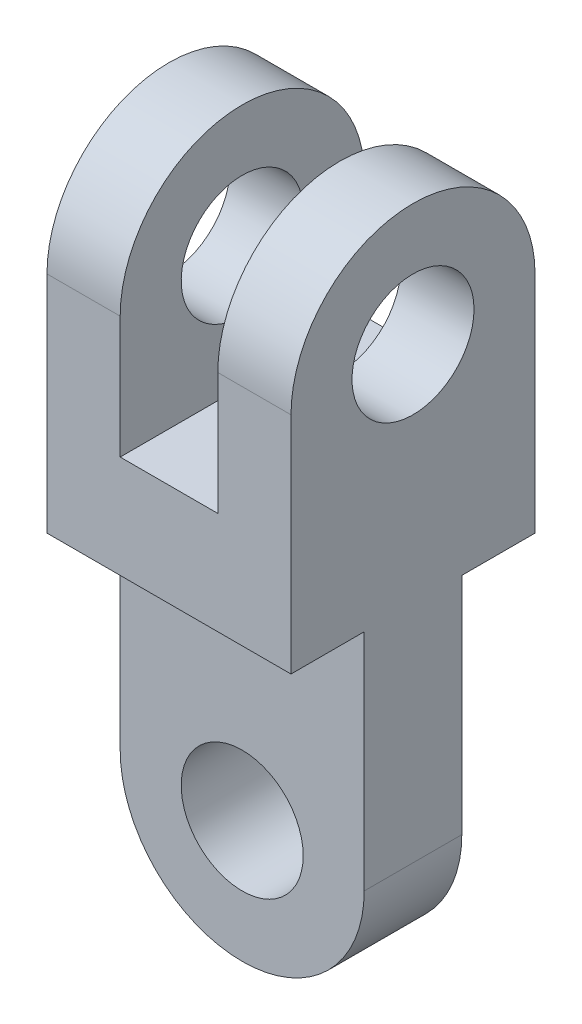
ISO-10303-21;
HEADER;
FILE_DESCRIPTION(('STEP AP214'),'2;1');
FILE_NAME('part.step','',(''),(''),'','','');
FILE_SCHEMA(('AUTOMOTIVE_DESIGN { 1 0 10303 214 1 1 1 1 }'));
ENDSEC;
DATA;
#1=APPLICATION_CONTEXT('core data for automotive mechanical design processes');
#2=APPLICATION_PROTOCOL_DEFINITION('international standard','automotive_design',2000,#1);
#3=PRODUCT_CONTEXT('',#1,'mechanical');
#4=PRODUCT('Part','Part','',(#3));
#5=PRODUCT_RELATED_PRODUCT_CATEGORY('part','',(#4));
#6=PRODUCT_DEFINITION_FORMATION('','',#4);
#7=PRODUCT_DEFINITION_CONTEXT('part definition',#1,'design');
#8=PRODUCT_DEFINITION('design','',#6,#7);
#9=PRODUCT_DEFINITION_SHAPE('','',#8);
#10=(LENGTH_UNIT() NAMED_UNIT(*) SI_UNIT(.MILLI.,.METRE.));
#11=(NAMED_UNIT(*) PLANE_ANGLE_UNIT() SI_UNIT($,.RADIAN.));
#12=(NAMED_UNIT(*) SI_UNIT($,.STERADIAN.) SOLID_ANGLE_UNIT());
#13=UNCERTAINTY_MEASURE_WITH_UNIT(LENGTH_MEASURE(1.E-05),#10,'distance_accuracy_value','');
#14=(GEOMETRIC_REPRESENTATION_CONTEXT(3) GLOBAL_UNCERTAINTY_ASSIGNED_CONTEXT((#13)) GLOBAL_UNIT_ASSIGNED_CONTEXT((#10,
#11,#12)) REPRESENTATION_CONTEXT('',''));
#15=CARTESIAN_POINT('',(0.,0.,0.));
#16=DIRECTION('',(0.,0.,1.));
#17=DIRECTION('',(1.,0.,0.));
#18=AXIS2_PLACEMENT_3D('',#15,#16,#17);
#19=CARTESIAN_POINT('',(50.,184.,-20.));
#20=DIRECTION('',(1.,0.,0.));
#21=DIRECTION('',(0.,0.,-1.));
#22=AXIS2_PLACEMENT_3D('',#19,#20,#21);
#23=CYLINDRICAL_SURFACE('',#22,50.);
#24=DIRECTION('',(-1.,0.,0.));
#25=VECTOR('',#24,1.);
#26=CARTESIAN_POINT('',(50.,184.,30.));
#27=LINE('',#26,#25);
#28=CARTESIAN_POINT('',(50.,184.,30.));
#29=VERTEX_POINT('',#28);
#30=CARTESIAN_POINT('',(20.,184.,30.));
#31=VERTEX_POINT('',#30);
#32=EDGE_CURVE('E149',#29,#31,#27,.T.);
#33=ORIENTED_EDGE('',*,*,#32,.F.);
#34=CARTESIAN_POINT('',(50.,184.,-20.));
#35=DIRECTION('',(1.,0.,0.));
#36=DIRECTION('',(0.,0.,-1.));
#37=AXIS2_PLACEMENT_3D('',#34,#35,#36);
#38=CIRCLE('',#37,50.);
#39=CARTESIAN_POINT('',(50.,184.,-70.));
#40=VERTEX_POINT('',#39);
#41=EDGE_CURVE('E52',#40,#29,#38,.T.);
#42=ORIENTED_EDGE('',*,*,#41,.F.);
#43=DIRECTION('',(1.,0.,0.));
#44=VECTOR('',#43,1.);
#45=CARTESIAN_POINT('',(0.,184.,-70.));
#46=LINE('',#45,#44);
#47=CARTESIAN_POINT('',(20.,184.,-70.));
#48=VERTEX_POINT('',#47);
#49=EDGE_CURVE('E260',#48,#40,#46,.T.);
#50=ORIENTED_EDGE('',*,*,#49,.F.);
#51=CARTESIAN_POINT('',(20.,184.,-20.));
#52=DIRECTION('',(1.,0.,0.));
#53=DIRECTION('',(0.,1.,0.));
#54=AXIS2_PLACEMENT_3D('',#51,#52,#53);
#55=CIRCLE('',#54,50.);
#56=EDGE_CURVE('E11',#31,#48,#55,.F.);
#57=ORIENTED_EDGE('',*,*,#56,.F.);
#58=EDGE_LOOP('',(#33,#42,#50,#57));
#59=FACE_BOUND('',#58,.T.);
#60=ADVANCED_FACE('F42',(#59),#23,.T.);
#61=CARTESIAN_POINT('',(-20.,184.,-20.));
#62=DIRECTION('',(1.,0.,0.));
#63=DIRECTION('',(0.,0.,-1.));
#64=AXIS2_PLACEMENT_3D('',#61,#62,#63);
#65=CYLINDRICAL_SURFACE('',#64,50.);
#66=DIRECTION('',(-1.,0.,0.));
#67=VECTOR('',#66,1.);
#68=CARTESIAN_POINT('',(-20.,184.,30.));
#69=LINE('',#68,#67);
#70=CARTESIAN_POINT('',(-20.,184.,30.));
#71=VERTEX_POINT('',#70);
#72=CARTESIAN_POINT('',(-50.,184.,30.));
#73=VERTEX_POINT('',#72);
#74=EDGE_CURVE('E242',#71,#73,#69,.T.);
#75=ORIENTED_EDGE('',*,*,#74,.F.);
#76=CARTESIAN_POINT('',(-20.,184.,-20.));
#77=DIRECTION('',(-1.,0.,0.));
#78=DIRECTION('',(0.,-1.,0.));
#79=AXIS2_PLACEMENT_3D('',#76,#77,#78);
#80=CIRCLE('',#79,50.);
#81=CARTESIAN_POINT('',(-20.,184.,-70.));
#82=VERTEX_POINT('',#81);
#83=EDGE_CURVE('E252',#82,#71,#80,.F.);
#84=ORIENTED_EDGE('',*,*,#83,.F.);
#85=DIRECTION('',(1.,0.,0.));
#86=VECTOR('',#85,1.);
#87=CARTESIAN_POINT('',(0.,184.,-70.));
#88=LINE('',#87,#86);
#89=CARTESIAN_POINT('',(-50.,184.,-70.));
#90=VERTEX_POINT('',#89);
#91=EDGE_CURVE('E248',#90,#82,#88,.T.);
#92=ORIENTED_EDGE('',*,*,#91,.F.);
#93=CARTESIAN_POINT('',(-50.,184.,-20.));
#94=DIRECTION('',(-1.,0.,0.));
#95=DIRECTION('',(0.,0.,1.));
#96=AXIS2_PLACEMENT_3D('',#93,#94,#95);
#97=CIRCLE('',#96,50.);
#98=EDGE_CURVE('E255',#73,#90,#97,.T.);
#99=ORIENTED_EDGE('',*,*,#98,.F.);
#100=EDGE_LOOP('',(#75,#84,#92,#99));
#101=FACE_BOUND('',#100,.T.);
#102=ADVANCED_FACE('F305',(#101),#65,.T.);
#103=CARTESIAN_POINT('',(0.,0.,-40.));
#104=DIRECTION('',(0.,0.,1.));
#105=DIRECTION('',(1.,0.,0.));
#106=AXIS2_PLACEMENT_3D('',#103,#104,#105);
#107=CYLINDRICAL_SURFACE('',#106,50.);
#108=CARTESIAN_POINT('',(0.,0.,0.));
#109=DIRECTION('',(0.,0.,1.));
#110=DIRECTION('',(1.,0.,0.));
#111=AXIS2_PLACEMENT_3D('',#108,#109,#110);
#112=CIRCLE('',#111,50.);
#113=CARTESIAN_POINT('',(-50.,0.,0.));
#114=VERTEX_POINT('',#113);
#115=CARTESIAN_POINT('',(50.,0.,0.));
#116=VERTEX_POINT('',#115);
#117=EDGE_CURVE('E205',#114,#116,#112,.T.);
#118=ORIENTED_EDGE('',*,*,#117,.F.);
#119=DIRECTION('',(0.,0.,1.));
#120=VECTOR('',#119,1.);
#121=CARTESIAN_POINT('',(-50.,0.,-40.));
#122=LINE('',#121,#120);
#123=CARTESIAN_POINT('',(-50.,0.,-40.));
#124=VERTEX_POINT('',#123);
#125=EDGE_CURVE('E239',#124,#114,#122,.T.);
#126=ORIENTED_EDGE('',*,*,#125,.F.);
#127=CARTESIAN_POINT('',(0.,0.,-40.));
#128=DIRECTION('',(0.,0.,1.));
#129=DIRECTION('',(1.,0.,0.));
#130=AXIS2_PLACEMENT_3D('',#127,#128,#129);
#131=CIRCLE('',#130,50.);
#132=CARTESIAN_POINT('',(50.,0.,-40.));
#133=VERTEX_POINT('',#132);
#134=EDGE_CURVE('E209',#124,#133,#131,.T.);
#135=ORIENTED_EDGE('',*,*,#134,.T.);
#136=DIRECTION('',(0.,0.,1.));
#137=VECTOR('',#136,1.);
#138=CARTESIAN_POINT('',(50.,0.,-40.));
#139=LINE('',#138,#137);
#140=EDGE_CURVE('E226',#133,#116,#139,.T.);
#141=ORIENTED_EDGE('',*,*,#140,.T.);
#142=EDGE_LOOP('',(#118,#126,#135,#141));
#143=FACE_BOUND('',#142,.T.);
#144=ADVANCED_FACE('F309',(#143),#107,.T.);
#145=CARTESIAN_POINT('',(-50.,0.,-40.));
#146=DIRECTION('',(-1.,0.,0.));
#147=DIRECTION('',(0.,0.,1.));
#148=AXIS2_PLACEMENT_3D('',#145,#146,#147);
#149=PLANE('',#148);
#150=CARTESIAN_POINT('',(-50.,184.,-20.));
#151=DIRECTION('',(1.,0.,0.));
#152=DIRECTION('',(0.,0.,-1.));
#153=AXIS2_PLACEMENT_3D('',#150,#151,#152);
#154=CIRCLE('',#153,25.);
#155=CARTESIAN_POINT('',(-50.,184.,-45.));
#156=VERTEX_POINT('',#155);
#157=EDGE_CURVE('E282',#156,#156,#154,.T.);
#158=ORIENTED_EDGE('',*,*,#157,.T.);
#159=EDGE_LOOP('',(#158));
#160=FACE_BOUND('',#159,.T.);
#161=DIRECTION('',(0.,1.,0.));
#162=VECTOR('',#161,1.);
#163=CARTESIAN_POINT('',(-50.,0.,30.));
#164=LINE('',#163,#162);
#165=CARTESIAN_POINT('',(-50.,92.,30.));
#166=VERTEX_POINT('',#165);
#167=EDGE_CURVE('E160',#166,#73,#164,.T.);
#168=ORIENTED_EDGE('',*,*,#167,.T.);
#169=ORIENTED_EDGE('',*,*,#98,.T.);
#170=DIRECTION('',(0.,1.,0.));
#171=VECTOR('',#170,1.);
#172=CARTESIAN_POINT('',(-50.,0.,-70.));
#173=LINE('',#172,#171);
#174=CARTESIAN_POINT('',(-50.,92.,-70.));
#175=VERTEX_POINT('',#174);
#176=EDGE_CURVE('E182',#175,#90,#173,.T.);
#177=ORIENTED_EDGE('',*,*,#176,.F.);
#178=DIRECTION('',(0.,0.,1.));
#179=VECTOR('',#178,1.);
#180=CARTESIAN_POINT('',(-50.,92.,-70.));
#181=LINE('',#180,#179);
#182=CARTESIAN_POINT('',(-50.,92.,-40.));
#183=VERTEX_POINT('',#182);
#184=EDGE_CURVE('E194',#175,#183,#181,.T.);
#185=ORIENTED_EDGE('',*,*,#184,.T.);
#186=DIRECTION('',(0.,-1.,0.));
#187=VECTOR('',#186,1.);
#188=CARTESIAN_POINT('',(-50.,0.,-40.));
#189=LINE('',#188,#187);
#190=EDGE_CURVE('E222',#183,#124,#189,.T.);
#191=ORIENTED_EDGE('',*,*,#190,.T.);
#192=ORIENTED_EDGE('',*,*,#125,.T.);
#193=DIRECTION('',(0.,-1.,0.));
#194=VECTOR('',#193,1.);
#195=CARTESIAN_POINT('',(-50.,0.,0.));
#196=LINE('',#195,#194);
#197=CARTESIAN_POINT('',(-50.,92.,0.));
#198=VERTEX_POINT('',#197);
#199=EDGE_CURVE('E214',#198,#114,#196,.T.);
#200=ORIENTED_EDGE('',*,*,#199,.F.);
#201=EDGE_CURVE('E198',#198,#166,#181,.T.);
#202=ORIENTED_EDGE('',*,*,#201,.T.);
#203=EDGE_LOOP('',(#168,#169,#177,#185,#191,#192,#200,#202));
#204=FACE_BOUND('',#203,.T.);
#205=ADVANCED_FACE('F314',(#160,#204),#149,.T.);
#206=CARTESIAN_POINT('',(50.,92.,-40.));
#207=DIRECTION('',(1.,0.,0.));
#208=DIRECTION('',(0.,0.,-1.));
#209=AXIS2_PLACEMENT_3D('',#206,#207,#208);
#210=PLANE('',#209);
#211=CARTESIAN_POINT('',(50.,184.,-20.));
#212=DIRECTION('',(1.,0.,0.));
#213=DIRECTION('',(0.,0.,-1.));
#214=AXIS2_PLACEMENT_3D('',#211,#212,#213);
#215=CIRCLE('',#214,25.);
#216=CARTESIAN_POINT('',(50.,184.,-45.));
#217=VERTEX_POINT('',#216);
#218=EDGE_CURVE('E278',#217,#217,#215,.T.);
#219=ORIENTED_EDGE('',*,*,#218,.F.);
#220=EDGE_LOOP('',(#219));
#221=FACE_BOUND('',#220,.T.);
#222=DIRECTION('',(0.,-1.,0.));
#223=VECTOR('',#222,1.);
#224=CARTESIAN_POINT('',(50.,0.,-70.));
#225=LINE('',#224,#223);
#226=CARTESIAN_POINT('',(50.,92.,-70.));
#227=VERTEX_POINT('',#226);
#228=EDGE_CURVE('E171',#40,#227,#225,.T.);
#229=ORIENTED_EDGE('',*,*,#228,.F.);
#230=ORIENTED_EDGE('',*,*,#41,.T.);
#231=DIRECTION('',(0.,-1.,0.));
#232=VECTOR('',#231,1.);
#233=CARTESIAN_POINT('',(50.,0.,30.));
#234=LINE('',#233,#232);
#235=CARTESIAN_POINT('',(50.,92.,30.));
#236=VERTEX_POINT('',#235);
#237=EDGE_CURVE('E151',#29,#236,#234,.T.);
#238=ORIENTED_EDGE('',*,*,#237,.T.);
#239=DIRECTION('',(0.,0.,1.));
#240=VECTOR('',#239,1.);
#241=CARTESIAN_POINT('',(50.,92.,-70.));
#242=LINE('',#241,#240);
#243=CARTESIAN_POINT('',(50.,92.,0.));
#244=VERTEX_POINT('',#243);
#245=EDGE_CURVE('E193',#244,#236,#242,.T.);
#246=ORIENTED_EDGE('',*,*,#245,.F.);
#247=DIRECTION('',(0.,1.,0.));
#248=VECTOR('',#247,1.);
#249=CARTESIAN_POINT('',(50.,92.,0.));
#250=LINE('',#249,#248);
#251=EDGE_CURVE('E230',#116,#244,#250,.T.);
#252=ORIENTED_EDGE('',*,*,#251,.F.);
#253=ORIENTED_EDGE('',*,*,#140,.F.);
#254=DIRECTION('',(0.,1.,0.));
#255=VECTOR('',#254,1.);
#256=CARTESIAN_POINT('',(50.,92.,-40.));
#257=LINE('',#256,#255);
#258=CARTESIAN_POINT('',(50.,92.,-40.));
#259=VERTEX_POINT('',#258);
#260=EDGE_CURVE('E213',#133,#259,#257,.T.);
#261=ORIENTED_EDGE('',*,*,#260,.T.);
#262=EDGE_CURVE('E188',#227,#259,#242,.T.);
#263=ORIENTED_EDGE('',*,*,#262,.F.);
#264=EDGE_LOOP('',(#229,#230,#238,#246,#252,#253,#261,#263));
#265=FACE_BOUND('',#264,.T.);
#266=ADVANCED_FACE('F266',(#221,#265),#210,.T.);
#267=CARTESIAN_POINT('',(0.,0.,-40.));
#268=DIRECTION('',(0.,0.,1.));
#269=DIRECTION('',(1.,0.,0.));
#270=AXIS2_PLACEMENT_3D('',#267,#268,#269);
#271=PLANE('',#270);
#272=CARTESIAN_POINT('',(0.,0.,-40.));
#273=DIRECTION('',(0.,0.,1.));
#274=DIRECTION('',(1.,0.,0.));
#275=AXIS2_PLACEMENT_3D('',#272,#273,#274);
#276=CIRCLE('',#275,25.);
#277=CARTESIAN_POINT('',(25.,0.,-40.));
#278=VERTEX_POINT('',#277);
#279=EDGE_CURVE('E201',#278,#278,#276,.T.);
#280=ORIENTED_EDGE('',*,*,#279,.T.);
#281=EDGE_LOOP('',(#280));
#282=FACE_BOUND('',#281,.T.);
#283=ORIENTED_EDGE('',*,*,#134,.F.);
#284=ORIENTED_EDGE('',*,*,#190,.F.);
#285=DIRECTION('',(-1.,0.,0.));
#286=VECTOR('',#285,1.);
#287=CARTESIAN_POINT('',(-50.,92.,-40.));
#288=LINE('',#287,#286);
#289=EDGE_CURVE('E218',#259,#183,#288,.T.);
#290=ORIENTED_EDGE('',*,*,#289,.F.);
#291=ORIENTED_EDGE('',*,*,#260,.F.);
#292=EDGE_LOOP('',(#283,#284,#290,#291));
#293=FACE_BOUND('',#292,.T.);
#294=ADVANCED_FACE('F324',(#282,#293),#271,.F.);
#295=CARTESIAN_POINT('',(0.,0.,0.));
#296=DIRECTION('',(0.,0.,1.));
#297=DIRECTION('',(1.,0.,0.));
#298=AXIS2_PLACEMENT_3D('',#295,#296,#297);
#299=PLANE('',#298);
#300=CARTESIAN_POINT('',(0.,0.,0.));
#301=DIRECTION('',(0.,0.,1.));
#302=DIRECTION('',(1.,0.,0.));
#303=AXIS2_PLACEMENT_3D('',#300,#301,#302);
#304=CIRCLE('',#303,25.);
#305=CARTESIAN_POINT('',(25.,0.,0.));
#306=VERTEX_POINT('',#305);
#307=EDGE_CURVE('E192',#306,#306,#304,.T.);
#308=ORIENTED_EDGE('',*,*,#307,.F.);
#309=EDGE_LOOP('',(#308));
#310=FACE_BOUND('',#309,.T.);
#311=ORIENTED_EDGE('',*,*,#117,.T.);
#312=ORIENTED_EDGE('',*,*,#251,.T.);
#313=DIRECTION('',(-1.,0.,0.));
#314=VECTOR('',#313,1.);
#315=CARTESIAN_POINT('',(-50.,92.,0.));
#316=LINE('',#315,#314);
#317=EDGE_CURVE('E233',#244,#198,#316,.T.);
#318=ORIENTED_EDGE('',*,*,#317,.T.);
#319=ORIENTED_EDGE('',*,*,#199,.T.);
#320=EDGE_LOOP('',(#311,#312,#318,#319));
#321=FACE_BOUND('',#320,.T.);
#322=ADVANCED_FACE('F328',(#310,#321),#299,.T.);
#323=CARTESIAN_POINT('',(0.,0.,-40.));
#324=DIRECTION('',(0.,0.,1.));
#325=DIRECTION('',(1.,0.,0.));
#326=AXIS2_PLACEMENT_3D('',#323,#324,#325);
#327=CYLINDRICAL_SURFACE('',#326,25.);
#328=ORIENTED_EDGE('',*,*,#279,.F.);
#329=EDGE_LOOP('',(#328));
#330=FACE_BOUND('',#329,.T.);
#331=ORIENTED_EDGE('',*,*,#307,.T.);
#332=EDGE_LOOP('',(#331));
#333=FACE_BOUND('',#332,.T.);
#334=ADVANCED_FACE('F331',(#330,#333),#327,.F.);
#335=CARTESIAN_POINT('',(0.,92.,-70.));
#336=DIRECTION('',(0.,1.,0.));
#337=DIRECTION('',(0.,0.,1.));
#338=AXIS2_PLACEMENT_3D('',#335,#336,#337);
#339=PLANE('',#338);
#340=ORIENTED_EDGE('',*,*,#262,.T.);
#341=ORIENTED_EDGE('',*,*,#289,.T.);
#342=ORIENTED_EDGE('',*,*,#184,.F.);
#343=DIRECTION('',(-1.,0.,0.));
#344=VECTOR('',#343,1.);
#345=CARTESIAN_POINT('',(0.,92.,-70.));
#346=LINE('',#345,#344);
#347=EDGE_CURVE('E140',#227,#175,#346,.T.);
#348=ORIENTED_EDGE('',*,*,#347,.F.);
#349=EDGE_LOOP('',(#340,#341,#342,#348));
#350=FACE_BOUND('',#349,.T.);
#351=ADVANCED_FACE('F338',(#350),#339,.F.);
#352=ORIENTED_EDGE('',*,*,#317,.F.);
#353=ORIENTED_EDGE('',*,*,#245,.T.);
#354=DIRECTION('',(-1.,0.,0.));
#355=VECTOR('',#354,1.);
#356=CARTESIAN_POINT('',(0.,92.,30.));
#357=LINE('',#356,#355);
#358=EDGE_CURVE('E167',#236,#166,#357,.T.);
#359=ORIENTED_EDGE('',*,*,#358,.T.);
#360=ORIENTED_EDGE('',*,*,#201,.F.);
#361=EDGE_LOOP('',(#352,#353,#359,#360));
#362=FACE_BOUND('',#361,.T.);
#363=ADVANCED_FACE('F347',(#362),#339,.F.);
#364=CARTESIAN_POINT('',(-20.,0.,-70.));
#365=DIRECTION('',(-1.,0.,0.));
#366=DIRECTION('',(0.,-1.,0.));
#367=AXIS2_PLACEMENT_3D('',#364,#365,#366);
#368=PLANE('',#367);
#369=CARTESIAN_POINT('',(-20.,184.,-20.));
#370=DIRECTION('',(-1.,0.,0.));
#371=DIRECTION('',(0.,-1.,0.));
#372=AXIS2_PLACEMENT_3D('',#369,#370,#371);
#373=CIRCLE('',#372,25.);
#374=CARTESIAN_POINT('',(-20.,159.,-20.));
#375=VERTEX_POINT('',#374);
#376=EDGE_CURVE('E273',#375,#375,#373,.T.);
#377=ORIENTED_EDGE('',*,*,#376,.T.);
#378=EDGE_LOOP('',(#377));
#379=FACE_BOUND('',#378,.T.);
#380=DIRECTION('',(0.,-1.,0.));
#381=VECTOR('',#380,1.);
#382=CARTESIAN_POINT('',(-20.,0.,-70.));
#383=LINE('',#382,#381);
#384=CARTESIAN_POINT('',(-20.,134.,-70.));
#385=VERTEX_POINT('',#384);
#386=EDGE_CURVE('E179',#82,#385,#383,.T.);
#387=ORIENTED_EDGE('',*,*,#386,.F.);
#388=ORIENTED_EDGE('',*,*,#83,.T.);
#389=DIRECTION('',(0.,-1.,0.));
#390=VECTOR('',#389,1.);
#391=CARTESIAN_POINT('',(-20.,0.,30.));
#392=LINE('',#391,#390);
#393=CARTESIAN_POINT('',(-20.,134.,30.));
#394=VERTEX_POINT('',#393);
#395=EDGE_CURVE('E157',#71,#394,#392,.T.);
#396=ORIENTED_EDGE('',*,*,#395,.T.);
#397=DIRECTION('',(0.,0.,1.));
#398=VECTOR('',#397,1.);
#399=CARTESIAN_POINT('',(-20.,134.,-70.));
#400=LINE('',#399,#398);
#401=EDGE_CURVE('E139',#385,#394,#400,.T.);
#402=ORIENTED_EDGE('',*,*,#401,.F.);
#403=EDGE_LOOP('',(#387,#388,#396,#402));
#404=FACE_BOUND('',#403,.T.);
#405=ADVANCED_FACE('F344',(#379,#404),#368,.F.);
#406=CARTESIAN_POINT('',(0.,134.,-70.));
#407=DIRECTION('',(0.,-1.,0.));
#408=DIRECTION('',(0.,0.,-1.));
#409=AXIS2_PLACEMENT_3D('',#406,#407,#408);
#410=PLANE('',#409);
#411=ORIENTED_EDGE('',*,*,#401,.T.);
#412=DIRECTION('',(1.,0.,0.));
#413=VECTOR('',#412,1.);
#414=CARTESIAN_POINT('',(0.,134.,30.));
#415=LINE('',#414,#413);
#416=CARTESIAN_POINT('',(20.,134.,30.));
#417=VERTEX_POINT('',#416);
#418=EDGE_CURVE('E148',#394,#417,#415,.T.);
#419=ORIENTED_EDGE('',*,*,#418,.T.);
#420=DIRECTION('',(0.,0.,1.));
#421=VECTOR('',#420,1.);
#422=CARTESIAN_POINT('',(20.,134.,-70.));
#423=LINE('',#422,#421);
#424=CARTESIAN_POINT('',(20.,134.,-70.));
#425=VERTEX_POINT('',#424);
#426=EDGE_CURVE('E129',#425,#417,#423,.T.);
#427=ORIENTED_EDGE('',*,*,#426,.F.);
#428=DIRECTION('',(1.,0.,0.));
#429=VECTOR('',#428,1.);
#430=CARTESIAN_POINT('',(0.,134.,-70.));
#431=LINE('',#430,#429);
#432=EDGE_CURVE('E176',#385,#425,#431,.T.);
#433=ORIENTED_EDGE('',*,*,#432,.F.);
#434=EDGE_LOOP('',(#411,#419,#427,#433));
#435=FACE_BOUND('',#434,.T.);
#436=ADVANCED_FACE('F154',(#435),#410,.F.);
#437=CARTESIAN_POINT('',(20.,0.,-70.));
#438=DIRECTION('',(1.,0.,0.));
#439=DIRECTION('',(0.,1.,0.));
#440=AXIS2_PLACEMENT_3D('',#437,#438,#439);
#441=PLANE('',#440);
#442=CARTESIAN_POINT('',(20.,184.,-20.));
#443=DIRECTION('',(1.,0.,0.));
#444=DIRECTION('',(0.,1.,0.));
#445=AXIS2_PLACEMENT_3D('',#442,#443,#444);
#446=CIRCLE('',#445,25.);
#447=CARTESIAN_POINT('',(20.,209.,-20.));
#448=VERTEX_POINT('',#447);
#449=EDGE_CURVE('E46',#448,#448,#446,.T.);
#450=ORIENTED_EDGE('',*,*,#449,.T.);
#451=EDGE_LOOP('',(#450));
#452=FACE_BOUND('',#451,.T.);
#453=DIRECTION('',(0.,1.,0.));
#454=VECTOR('',#453,1.);
#455=CARTESIAN_POINT('',(20.,0.,30.));
#456=LINE('',#455,#454);
#457=EDGE_CURVE('E132',#417,#31,#456,.T.);
#458=ORIENTED_EDGE('',*,*,#457,.T.);
#459=ORIENTED_EDGE('',*,*,#56,.T.);
#460=DIRECTION('',(0.,1.,0.));
#461=VECTOR('',#460,1.);
#462=CARTESIAN_POINT('',(20.,0.,-70.));
#463=LINE('',#462,#461);
#464=EDGE_CURVE('E134',#425,#48,#463,.T.);
#465=ORIENTED_EDGE('',*,*,#464,.F.);
#466=ORIENTED_EDGE('',*,*,#426,.T.);
#467=EDGE_LOOP('',(#458,#459,#465,#466));
#468=FACE_BOUND('',#467,.T.);
#469=ADVANCED_FACE('F131',(#452,#468),#441,.F.);
#470=CARTESIAN_POINT('',(0.,0.,-70.));
#471=DIRECTION('',(0.,0.,1.));
#472=DIRECTION('',(1.,0.,0.));
#473=AXIS2_PLACEMENT_3D('',#470,#471,#472);
#474=PLANE('',#473);
#475=ORIENTED_EDGE('',*,*,#464,.T.);
#476=ORIENTED_EDGE('',*,*,#49,.T.);
#477=ORIENTED_EDGE('',*,*,#228,.T.);
#478=ORIENTED_EDGE('',*,*,#347,.T.);
#479=ORIENTED_EDGE('',*,*,#176,.T.);
#480=ORIENTED_EDGE('',*,*,#91,.T.);
#481=ORIENTED_EDGE('',*,*,#386,.T.);
#482=ORIENTED_EDGE('',*,*,#432,.T.);
#483=EDGE_LOOP('',(#475,#476,#477,#478,#479,#480,#481,#482));
#484=FACE_BOUND('',#483,.T.);
#485=ADVANCED_FACE('F302',(#484),#474,.F.);
#486=CARTESIAN_POINT('',(0.,0.,30.));
#487=DIRECTION('',(0.,0.,1.));
#488=DIRECTION('',(1.,0.,0.));
#489=AXIS2_PLACEMENT_3D('',#486,#487,#488);
#490=PLANE('',#489);
#491=ORIENTED_EDGE('',*,*,#237,.F.);
#492=ORIENTED_EDGE('',*,*,#32,.T.);
#493=ORIENTED_EDGE('',*,*,#457,.F.);
#494=ORIENTED_EDGE('',*,*,#418,.F.);
#495=ORIENTED_EDGE('',*,*,#395,.F.);
#496=ORIENTED_EDGE('',*,*,#74,.T.);
#497=ORIENTED_EDGE('',*,*,#167,.F.);
#498=ORIENTED_EDGE('',*,*,#358,.F.);
#499=EDGE_LOOP('',(#491,#492,#493,#494,#495,#496,#497,#498));
#500=FACE_BOUND('',#499,.T.);
#501=ADVANCED_FACE('F146',(#500),#490,.T.);
#502=CARTESIAN_POINT('',(-50.,184.,-20.));
#503=DIRECTION('',(1.,0.,0.));
#504=DIRECTION('',(0.,0.,-1.));
#505=AXIS2_PLACEMENT_3D('',#502,#503,#504);
#506=CYLINDRICAL_SURFACE('',#505,25.);
#507=ORIENTED_EDGE('',*,*,#218,.T.);
#508=EDGE_LOOP('',(#507));
#509=FACE_BOUND('',#508,.T.);
#510=ORIENTED_EDGE('',*,*,#449,.F.);
#511=EDGE_LOOP('',(#510));
#512=FACE_BOUND('',#511,.T.);
#513=ADVANCED_FACE('F292',(#509,#512),#506,.F.);
#514=ORIENTED_EDGE('',*,*,#157,.F.);
#515=EDGE_LOOP('',(#514));
#516=FACE_BOUND('',#515,.T.);
#517=ORIENTED_EDGE('',*,*,#376,.F.);
#518=EDGE_LOOP('',(#517));
#519=FACE_BOUND('',#518,.T.);
#520=ADVANCED_FACE('F294',(#516,#519),#506,.F.);
#521=CLOSED_SHELL('',(#60,#102,#144,#205,#266,#294,#322,#334,#351,#363,#405,#436,#469,#485,#501,
#513,#520));
#522=MANIFOLD_SOLID_BREP('B2',#521);
#523=ADVANCED_BREP_SHAPE_REPRESENTATION('',(#18,#522),#14);
#524=SHAPE_DEFINITION_REPRESENTATION(#9,#523);
ENDSEC;
END-ISO-10303-21;
